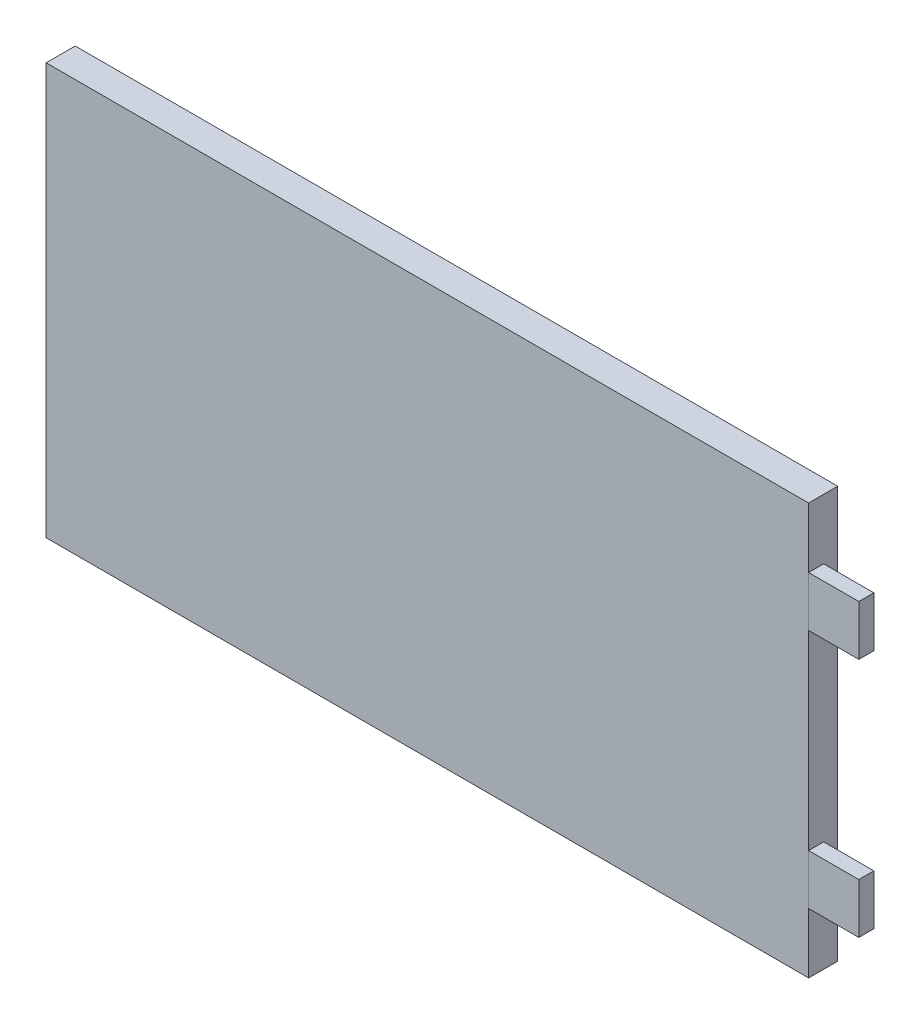
ISO-10303-21;
HEADER;
FILE_DESCRIPTION(('STEP AP214'),'2;1');
FILE_NAME('part.step','',(''),(''),'','','');
FILE_SCHEMA(('AUTOMOTIVE_DESIGN { 1 0 10303 214 1 1 1 1 }'));
ENDSEC;
DATA;
#1=APPLICATION_CONTEXT('core data for automotive mechanical design processes');
#2=APPLICATION_PROTOCOL_DEFINITION('international standard','automotive_design',2000,#1);
#3=PRODUCT_CONTEXT('',#1,'mechanical');
#4=PRODUCT('Part','Part','',(#3));
#5=PRODUCT_RELATED_PRODUCT_CATEGORY('part','',(#4));
#6=PRODUCT_DEFINITION_FORMATION('','',#4);
#7=PRODUCT_DEFINITION_CONTEXT('part definition',#1,'design');
#8=PRODUCT_DEFINITION('design','',#6,#7);
#9=PRODUCT_DEFINITION_SHAPE('','',#8);
#10=(LENGTH_UNIT() NAMED_UNIT(*) SI_UNIT(.MILLI.,.METRE.));
#11=(NAMED_UNIT(*) PLANE_ANGLE_UNIT() SI_UNIT($,.RADIAN.));
#12=(NAMED_UNIT(*) SI_UNIT($,.STERADIAN.) SOLID_ANGLE_UNIT());
#13=UNCERTAINTY_MEASURE_WITH_UNIT(LENGTH_MEASURE(1.E-05),#10,'distance_accuracy_value','');
#14=(GEOMETRIC_REPRESENTATION_CONTEXT(3) GLOBAL_UNCERTAINTY_ASSIGNED_CONTEXT((#13)) GLOBAL_UNIT_ASSIGNED_CONTEXT((#10,
#11,#12)) REPRESENTATION_CONTEXT('',''));
#15=CARTESIAN_POINT('',(0.,0.,0.));
#16=DIRECTION('',(0.,0.,1.));
#17=DIRECTION('',(1.,0.,0.));
#18=AXIS2_PLACEMENT_3D('',#15,#16,#17);
#19=CARTESIAN_POINT('',(38.,-9.5,1.4));
#20=DIRECTION('',(-1.,0.,0.));
#21=DIRECTION('',(0.,0.,1.));
#22=AXIS2_PLACEMENT_3D('',#19,#20,#21);
#23=PLANE('',#22);
#24=DIRECTION('',(0.,-1.,0.));
#25=VECTOR('',#24,1.);
#26=CARTESIAN_POINT('',(38.,-9.5,2.9));
#27=LINE('',#26,#25);
#28=CARTESIAN_POINT('',(38.,-9.5,2.9));
#29=VERTEX_POINT('',#28);
#30=CARTESIAN_POINT('',(38.,-14.5,2.9));
#31=VERTEX_POINT('',#30);
#32=EDGE_CURVE('E109',#29,#31,#27,.T.);
#33=ORIENTED_EDGE('',*,*,#32,.F.);
#34=DIRECTION('',(0.,0.,1.));
#35=VECTOR('',#34,1.);
#36=CARTESIAN_POINT('',(38.,-9.5,1.4));
#37=LINE('',#36,#35);
#38=CARTESIAN_POINT('',(38.,-9.5,1.4));
#39=VERTEX_POINT('',#38);
#40=EDGE_CURVE('E12',#39,#29,#37,.T.);
#41=ORIENTED_EDGE('',*,*,#40,.F.);
#42=DIRECTION('',(0.,-1.,0.));
#43=VECTOR('',#42,1.);
#44=CARTESIAN_POINT('',(38.,-9.5,1.4));
#45=LINE('',#44,#43);
#46=CARTESIAN_POINT('',(38.,-14.5,1.4));
#47=VERTEX_POINT('',#46);
#48=EDGE_CURVE('E103',#39,#47,#45,.T.);
#49=ORIENTED_EDGE('',*,*,#48,.T.);
#50=DIRECTION('',(0.,0.,1.));
#51=VECTOR('',#50,1.);
#52=CARTESIAN_POINT('',(38.,-14.5,1.4));
#53=LINE('',#52,#51);
#54=EDGE_CURVE('E48',#47,#31,#53,.T.);
#55=ORIENTED_EDGE('',*,*,#54,.T.);
#56=EDGE_LOOP('',(#33,#41,#49,#55));
#57=FACE_BOUND('',#56,.T.);
#58=ADVANCED_FACE('F45',(#57),#23,.T.);
#59=CARTESIAN_POINT('',(38.,-9.5,1.4));
#60=DIRECTION('',(0.,1.,0.));
#61=DIRECTION('',(0.,0.,1.));
#62=AXIS2_PLACEMENT_3D('',#59,#60,#61);
#63=PLANE('',#62);
#64=DIRECTION('',(-1.,0.,0.));
#65=VECTOR('',#64,1.);
#66=CARTESIAN_POINT('',(38.,-9.5,2.9));
#67=LINE('',#66,#65);
#68=CARTESIAN_POINT('',(43.,-9.5,2.9));
#69=VERTEX_POINT('',#68);
#70=EDGE_CURVE('E105',#69,#29,#67,.T.);
#71=ORIENTED_EDGE('',*,*,#70,.F.);
#72=DIRECTION('',(0.,0.,1.));
#73=VECTOR('',#72,1.);
#74=CARTESIAN_POINT('',(43.,-9.5,1.4));
#75=LINE('',#74,#73);
#76=CARTESIAN_POINT('',(43.,-9.5,1.4));
#77=VERTEX_POINT('',#76);
#78=EDGE_CURVE('E54',#77,#69,#75,.T.);
#79=ORIENTED_EDGE('',*,*,#78,.F.);
#80=DIRECTION('',(-1.,0.,0.));
#81=VECTOR('',#80,1.);
#82=CARTESIAN_POINT('',(38.,-9.5,1.4));
#83=LINE('',#82,#81);
#84=EDGE_CURVE('E100',#77,#39,#83,.T.);
#85=ORIENTED_EDGE('',*,*,#84,.T.);
#86=ORIENTED_EDGE('',*,*,#40,.T.);
#87=EDGE_LOOP('',(#71,#79,#85,#86));
#88=FACE_BOUND('',#87,.T.);
#89=ADVANCED_FACE('F119',(#88),#63,.T.);
#90=CARTESIAN_POINT('',(43.,-9.5,1.4));
#91=DIRECTION('',(1.,0.,0.));
#92=DIRECTION('',(0.,0.,-1.));
#93=AXIS2_PLACEMENT_3D('',#90,#91,#92);
#94=PLANE('',#93);
#95=DIRECTION('',(0.,1.,0.));
#96=VECTOR('',#95,1.);
#97=CARTESIAN_POINT('',(43.,-9.5,2.9));
#98=LINE('',#97,#96);
#99=CARTESIAN_POINT('',(43.,-14.5,2.9));
#100=VERTEX_POINT('',#99);
#101=EDGE_CURVE('E95',#100,#69,#98,.T.);
#102=ORIENTED_EDGE('',*,*,#101,.F.);
#103=DIRECTION('',(0.,0.,1.));
#104=VECTOR('',#103,1.);
#105=CARTESIAN_POINT('',(43.,-14.5,1.4));
#106=LINE('',#105,#104);
#107=CARTESIAN_POINT('',(43.,-14.5,1.4));
#108=VERTEX_POINT('',#107);
#109=EDGE_CURVE('E90',#108,#100,#106,.T.);
#110=ORIENTED_EDGE('',*,*,#109,.F.);
#111=DIRECTION('',(0.,1.,0.));
#112=VECTOR('',#111,1.);
#113=CARTESIAN_POINT('',(43.,-9.5,1.4));
#114=LINE('',#113,#112);
#115=EDGE_CURVE('E93',#108,#77,#114,.T.);
#116=ORIENTED_EDGE('',*,*,#115,.T.);
#117=ORIENTED_EDGE('',*,*,#78,.T.);
#118=EDGE_LOOP('',(#102,#110,#116,#117));
#119=FACE_BOUND('',#118,.T.);
#120=ADVANCED_FACE('F92',(#119),#94,.T.);
#121=CARTESIAN_POINT('',(38.,-14.5,1.4));
#122=DIRECTION('',(0.,-1.,0.));
#123=DIRECTION('',(1.,0.,0.));
#124=AXIS2_PLACEMENT_3D('',#121,#122,#123);
#125=PLANE('',#124);
#126=DIRECTION('',(1.,0.,0.));
#127=VECTOR('',#126,1.);
#128=CARTESIAN_POINT('',(38.,-14.5,2.9));
#129=LINE('',#128,#127);
#130=EDGE_CURVE('E112',#31,#100,#129,.T.);
#131=ORIENTED_EDGE('',*,*,#130,.F.);
#132=ORIENTED_EDGE('',*,*,#54,.F.);
#133=DIRECTION('',(1.,0.,0.));
#134=VECTOR('',#133,1.);
#135=CARTESIAN_POINT('',(38.,-14.5,1.4));
#136=LINE('',#135,#134);
#137=EDGE_CURVE('E99',#47,#108,#136,.T.);
#138=ORIENTED_EDGE('',*,*,#137,.T.);
#139=ORIENTED_EDGE('',*,*,#109,.T.);
#140=EDGE_LOOP('',(#131,#132,#138,#139));
#141=FACE_BOUND('',#140,.T.);
#142=ADVANCED_FACE('F102',(#141),#125,.T.);
#143=CARTESIAN_POINT('',(0.,0.,1.4));
#144=DIRECTION('',(0.,0.,1.));
#145=DIRECTION('',(1.,0.,0.));
#146=AXIS2_PLACEMENT_3D('',#143,#144,#145);
#147=PLANE('',#146);
#148=ORIENTED_EDGE('',*,*,#48,.F.);
#149=ORIENTED_EDGE('',*,*,#84,.F.);
#150=ORIENTED_EDGE('',*,*,#115,.F.);
#151=ORIENTED_EDGE('',*,*,#137,.F.);
#152=EDGE_LOOP('',(#148,#149,#150,#151));
#153=FACE_BOUND('',#152,.T.);
#154=ADVANCED_FACE('F98',(#153),#147,.F.);
#155=CARTESIAN_POINT('',(0.,0.,2.9));
#156=DIRECTION('',(0.,0.,1.));
#157=DIRECTION('',(1.,0.,0.));
#158=AXIS2_PLACEMENT_3D('',#155,#156,#157);
#159=PLANE('',#158);
#160=ORIENTED_EDGE('',*,*,#32,.T.);
#161=ORIENTED_EDGE('',*,*,#130,.T.);
#162=ORIENTED_EDGE('',*,*,#101,.T.);
#163=ORIENTED_EDGE('',*,*,#70,.T.);
#164=EDGE_LOOP('',(#160,#161,#162,#163));
#165=FACE_BOUND('',#164,.T.);
#166=ADVANCED_FACE('F118',(#165),#159,.T.);
#167=CLOSED_SHELL('',(#58,#89,#120,#142,#154,#166));
#168=MANIFOLD_SOLID_BREP('B2',#167);
#169=CARTESIAN_POINT('',(38.,14.5,1.4));
#170=DIRECTION('',(-1.,0.,0.));
#171=DIRECTION('',(0.,0.,1.));
#172=AXIS2_PLACEMENT_3D('',#169,#170,#171);
#173=PLANE('',#172);
#174=DIRECTION('',(0.,-1.,0.));
#175=VECTOR('',#174,1.);
#176=CARTESIAN_POINT('',(38.,14.5,2.9));
#177=LINE('',#176,#175);
#178=CARTESIAN_POINT('',(38.,14.5,2.9));
#179=VERTEX_POINT('',#178);
#180=CARTESIAN_POINT('',(38.,9.5,2.9));
#181=VERTEX_POINT('',#180);
#182=EDGE_CURVE('E241',#179,#181,#177,.T.);
#183=ORIENTED_EDGE('',*,*,#182,.F.);
#184=DIRECTION('',(0.,0.,1.));
#185=VECTOR('',#184,1.);
#186=CARTESIAN_POINT('',(38.,14.5,1.4));
#187=LINE('',#186,#185);
#188=CARTESIAN_POINT('',(38.,14.5,1.4));
#189=VERTEX_POINT('',#188);
#190=EDGE_CURVE('E43',#189,#179,#187,.T.);
#191=ORIENTED_EDGE('',*,*,#190,.F.);
#192=DIRECTION('',(0.,-1.,0.));
#193=VECTOR('',#192,1.);
#194=CARTESIAN_POINT('',(38.,14.5,1.4));
#195=LINE('',#194,#193);
#196=CARTESIAN_POINT('',(38.,9.5,1.4));
#197=VERTEX_POINT('',#196);
#198=EDGE_CURVE('E235',#189,#197,#195,.T.);
#199=ORIENTED_EDGE('',*,*,#198,.T.);
#200=DIRECTION('',(0.,0.,1.));
#201=VECTOR('',#200,1.);
#202=CARTESIAN_POINT('',(38.,9.5,1.4));
#203=LINE('',#202,#201);
#204=EDGE_CURVE('E180',#197,#181,#203,.T.);
#205=ORIENTED_EDGE('',*,*,#204,.T.);
#206=EDGE_LOOP('',(#183,#191,#199,#205));
#207=FACE_BOUND('',#206,.T.);
#208=ADVANCED_FACE('F177',(#207),#173,.T.);
#209=CARTESIAN_POINT('',(38.,14.5,1.4));
#210=DIRECTION('',(0.,1.,0.));
#211=DIRECTION('',(-1.,0.,0.));
#212=AXIS2_PLACEMENT_3D('',#209,#210,#211);
#213=PLANE('',#212);
#214=DIRECTION('',(-1.,0.,0.));
#215=VECTOR('',#214,1.);
#216=CARTESIAN_POINT('',(38.,14.5,2.9));
#217=LINE('',#216,#215);
#218=CARTESIAN_POINT('',(43.,14.5,2.9));
#219=VERTEX_POINT('',#218);
#220=EDGE_CURVE('E237',#219,#179,#217,.T.);
#221=ORIENTED_EDGE('',*,*,#220,.F.);
#222=DIRECTION('',(0.,0.,1.));
#223=VECTOR('',#222,1.);
#224=CARTESIAN_POINT('',(43.,14.5,1.4));
#225=LINE('',#224,#223);
#226=CARTESIAN_POINT('',(43.,14.5,1.4));
#227=VERTEX_POINT('',#226);
#228=EDGE_CURVE('E186',#227,#219,#225,.T.);
#229=ORIENTED_EDGE('',*,*,#228,.F.);
#230=DIRECTION('',(-1.,0.,0.));
#231=VECTOR('',#230,1.);
#232=CARTESIAN_POINT('',(38.,14.5,1.4));
#233=LINE('',#232,#231);
#234=EDGE_CURVE('E232',#227,#189,#233,.T.);
#235=ORIENTED_EDGE('',*,*,#234,.T.);
#236=ORIENTED_EDGE('',*,*,#190,.T.);
#237=EDGE_LOOP('',(#221,#229,#235,#236));
#238=FACE_BOUND('',#237,.T.);
#239=ADVANCED_FACE('F251',(#238),#213,.T.);
#240=CARTESIAN_POINT('',(43.,14.5,1.4));
#241=DIRECTION('',(1.,0.,0.));
#242=DIRECTION('',(0.,0.,-1.));
#243=AXIS2_PLACEMENT_3D('',#240,#241,#242);
#244=PLANE('',#243);
#245=DIRECTION('',(0.,1.,0.));
#246=VECTOR('',#245,1.);
#247=CARTESIAN_POINT('',(43.,14.5,2.9));
#248=LINE('',#247,#246);
#249=CARTESIAN_POINT('',(43.,9.5,2.9));
#250=VERTEX_POINT('',#249);
#251=EDGE_CURVE('E227',#250,#219,#248,.T.);
#252=ORIENTED_EDGE('',*,*,#251,.F.);
#253=DIRECTION('',(0.,0.,1.));
#254=VECTOR('',#253,1.);
#255=CARTESIAN_POINT('',(43.,9.5,1.4));
#256=LINE('',#255,#254);
#257=CARTESIAN_POINT('',(43.,9.5,1.4));
#258=VERTEX_POINT('',#257);
#259=EDGE_CURVE('E222',#258,#250,#256,.T.);
#260=ORIENTED_EDGE('',*,*,#259,.F.);
#261=DIRECTION('',(0.,1.,0.));
#262=VECTOR('',#261,1.);
#263=CARTESIAN_POINT('',(43.,14.5,1.4));
#264=LINE('',#263,#262);
#265=EDGE_CURVE('E225',#258,#227,#264,.T.);
#266=ORIENTED_EDGE('',*,*,#265,.T.);
#267=ORIENTED_EDGE('',*,*,#228,.T.);
#268=EDGE_LOOP('',(#252,#260,#266,#267));
#269=FACE_BOUND('',#268,.T.);
#270=ADVANCED_FACE('F224',(#269),#244,.T.);
#271=CARTESIAN_POINT('',(38.,9.5,1.4));
#272=DIRECTION('',(0.,-1.,0.));
#273=DIRECTION('',(0.,0.,-1.));
#274=AXIS2_PLACEMENT_3D('',#271,#272,#273);
#275=PLANE('',#274);
#276=DIRECTION('',(1.,0.,0.));
#277=VECTOR('',#276,1.);
#278=CARTESIAN_POINT('',(38.,9.5,2.9));
#279=LINE('',#278,#277);
#280=EDGE_CURVE('E244',#181,#250,#279,.T.);
#281=ORIENTED_EDGE('',*,*,#280,.F.);
#282=ORIENTED_EDGE('',*,*,#204,.F.);
#283=DIRECTION('',(1.,0.,0.));
#284=VECTOR('',#283,1.);
#285=CARTESIAN_POINT('',(38.,9.5,1.4));
#286=LINE('',#285,#284);
#287=EDGE_CURVE('E231',#197,#258,#286,.T.);
#288=ORIENTED_EDGE('',*,*,#287,.T.);
#289=ORIENTED_EDGE('',*,*,#259,.T.);
#290=EDGE_LOOP('',(#281,#282,#288,#289));
#291=FACE_BOUND('',#290,.T.);
#292=ADVANCED_FACE('F234',(#291),#275,.T.);
#293=CARTESIAN_POINT('',(0.,0.,1.4));
#294=DIRECTION('',(0.,0.,1.));
#295=DIRECTION('',(1.,0.,0.));
#296=AXIS2_PLACEMENT_3D('',#293,#294,#295);
#297=PLANE('',#296);
#298=ORIENTED_EDGE('',*,*,#198,.F.);
#299=ORIENTED_EDGE('',*,*,#234,.F.);
#300=ORIENTED_EDGE('',*,*,#265,.F.);
#301=ORIENTED_EDGE('',*,*,#287,.F.);
#302=EDGE_LOOP('',(#298,#299,#300,#301));
#303=FACE_BOUND('',#302,.T.);
#304=ADVANCED_FACE('F230',(#303),#297,.F.);
#305=CARTESIAN_POINT('',(0.,0.,2.9));
#306=DIRECTION('',(0.,0.,1.));
#307=DIRECTION('',(1.,0.,0.));
#308=AXIS2_PLACEMENT_3D('',#305,#306,#307);
#309=PLANE('',#308);
#310=ORIENTED_EDGE('',*,*,#182,.T.);
#311=ORIENTED_EDGE('',*,*,#280,.T.);
#312=ORIENTED_EDGE('',*,*,#251,.T.);
#313=ORIENTED_EDGE('',*,*,#220,.T.);
#314=EDGE_LOOP('',(#310,#311,#312,#313));
#315=FACE_BOUND('',#314,.T.);
#316=ADVANCED_FACE('F250',(#315),#309,.T.);
#317=CLOSED_SHELL('',(#208,#239,#270,#292,#304,#316));
#318=MANIFOLD_SOLID_BREP('B6',#317);
#319=CARTESIAN_POINT('',(38.,20.5,2.9));
#320=DIRECTION('',(-1.,0.,0.));
#321=DIRECTION('',(0.,-1.,0.));
#322=AXIS2_PLACEMENT_3D('',#319,#320,#321);
#323=PLANE('',#322);
#324=DIRECTION('',(0.,1.,0.));
#325=VECTOR('',#324,1.);
#326=CARTESIAN_POINT('',(38.,20.5,0.));
#327=LINE('',#326,#325);
#328=CARTESIAN_POINT('',(38.,-20.5,0.));
#329=VERTEX_POINT('',#328);
#330=CARTESIAN_POINT('',(38.,20.5,0.));
#331=VERTEX_POINT('',#330);
#332=EDGE_CURVE('E369',#329,#331,#327,.T.);
#333=ORIENTED_EDGE('',*,*,#332,.T.);
#334=DIRECTION('',(0.,0.,-1.));
#335=VECTOR('',#334,1.);
#336=CARTESIAN_POINT('',(38.,20.5,2.9));
#337=LINE('',#336,#335);
#338=CARTESIAN_POINT('',(38.,20.5,2.9));
#339=VERTEX_POINT('',#338);
#340=EDGE_CURVE('E175',#339,#331,#337,.T.);
#341=ORIENTED_EDGE('',*,*,#340,.F.);
#342=DIRECTION('',(0.,1.,0.));
#343=VECTOR('',#342,1.);
#344=CARTESIAN_POINT('',(38.,20.5,2.9));
#345=LINE('',#344,#343);
#346=CARTESIAN_POINT('',(38.,-20.5,2.9));
#347=VERTEX_POINT('',#346);
#348=EDGE_CURVE('E357',#347,#339,#345,.T.);
#349=ORIENTED_EDGE('',*,*,#348,.F.);
#350=DIRECTION('',(0.,0.,-1.));
#351=VECTOR('',#350,1.);
#352=CARTESIAN_POINT('',(38.,-20.5,2.9));
#353=LINE('',#352,#351);
#354=EDGE_CURVE('E365',#347,#329,#353,.T.);
#355=ORIENTED_EDGE('',*,*,#354,.T.);
#356=EDGE_LOOP('',(#333,#341,#349,#355));
#357=FACE_BOUND('',#356,.T.);
#358=ADVANCED_FACE('F306',(#357),#323,.F.);
#359=CARTESIAN_POINT('',(-38.,20.5,2.9));
#360=DIRECTION('',(0.,-1.,0.));
#361=DIRECTION('',(0.,0.,-1.));
#362=AXIS2_PLACEMENT_3D('',#359,#360,#361);
#363=PLANE('',#362);
#364=DIRECTION('',(-1.,0.,0.));
#365=VECTOR('',#364,1.);
#366=CARTESIAN_POINT('',(-38.,20.5,0.));
#367=LINE('',#366,#365);
#368=CARTESIAN_POINT('',(-38.,20.5,0.));
#369=VERTEX_POINT('',#368);
#370=EDGE_CURVE('E361',#331,#369,#367,.T.);
#371=ORIENTED_EDGE('',*,*,#370,.T.);
#372=DIRECTION('',(0.,0.,-1.));
#373=VECTOR('',#372,1.);
#374=CARTESIAN_POINT('',(-38.,20.5,2.9));
#375=LINE('',#374,#373);
#376=CARTESIAN_POINT('',(-38.,20.5,2.9));
#377=VERTEX_POINT('',#376);
#378=EDGE_CURVE('E314',#377,#369,#375,.T.);
#379=ORIENTED_EDGE('',*,*,#378,.F.);
#380=DIRECTION('',(-1.,0.,0.));
#381=VECTOR('',#380,1.);
#382=CARTESIAN_POINT('',(-38.,20.5,2.9));
#383=LINE('',#382,#381);
#384=EDGE_CURVE('E352',#339,#377,#383,.T.);
#385=ORIENTED_EDGE('',*,*,#384,.F.);
#386=ORIENTED_EDGE('',*,*,#340,.T.);
#387=EDGE_LOOP('',(#371,#379,#385,#386));
#388=FACE_BOUND('',#387,.T.);
#389=ADVANCED_FACE('F360',(#388),#363,.F.);
#390=CARTESIAN_POINT('',(-38.,20.5,2.9));
#391=DIRECTION('',(1.,0.,0.));
#392=DIRECTION('',(0.,1.,0.));
#393=AXIS2_PLACEMENT_3D('',#390,#391,#392);
#394=PLANE('',#393);
#395=DIRECTION('',(0.,-1.,0.));
#396=VECTOR('',#395,1.);
#397=CARTESIAN_POINT('',(-38.,20.5,0.));
#398=LINE('',#397,#396);
#399=CARTESIAN_POINT('',(-38.,-20.5,0.));
#400=VERTEX_POINT('',#399);
#401=EDGE_CURVE('E339',#369,#400,#398,.T.);
#402=ORIENTED_EDGE('',*,*,#401,.T.);
#403=DIRECTION('',(0.,0.,-1.));
#404=VECTOR('',#403,1.);
#405=CARTESIAN_POINT('',(-38.,-20.5,2.9));
#406=LINE('',#405,#404);
#407=CARTESIAN_POINT('',(-38.,-20.5,2.9));
#408=VERTEX_POINT('',#407);
#409=EDGE_CURVE('E362',#408,#400,#406,.T.);
#410=ORIENTED_EDGE('',*,*,#409,.F.);
#411=DIRECTION('',(0.,-1.,0.));
#412=VECTOR('',#411,1.);
#413=CARTESIAN_POINT('',(-38.,20.5,2.9));
#414=LINE('',#413,#412);
#415=EDGE_CURVE('E355',#377,#408,#414,.T.);
#416=ORIENTED_EDGE('',*,*,#415,.F.);
#417=ORIENTED_EDGE('',*,*,#378,.T.);
#418=EDGE_LOOP('',(#402,#410,#416,#417));
#419=FACE_BOUND('',#418,.T.);
#420=ADVANCED_FACE('F363',(#419),#394,.F.);
#421=CARTESIAN_POINT('',(-38.,-20.5,2.9));
#422=DIRECTION('',(0.,1.,0.));
#423=DIRECTION('',(0.,0.,1.));
#424=AXIS2_PLACEMENT_3D('',#421,#422,#423);
#425=PLANE('',#424);
#426=DIRECTION('',(1.,0.,0.));
#427=VECTOR('',#426,1.);
#428=CARTESIAN_POINT('',(-38.,-20.5,0.));
#429=LINE('',#428,#427);
#430=EDGE_CURVE('E345',#400,#329,#429,.T.);
#431=ORIENTED_EDGE('',*,*,#430,.T.);
#432=ORIENTED_EDGE('',*,*,#354,.F.);
#433=DIRECTION('',(1.,0.,0.));
#434=VECTOR('',#433,1.);
#435=CARTESIAN_POINT('',(-38.,-20.5,2.9));
#436=LINE('',#435,#434);
#437=EDGE_CURVE('E322',#408,#347,#436,.T.);
#438=ORIENTED_EDGE('',*,*,#437,.F.);
#439=ORIENTED_EDGE('',*,*,#409,.T.);
#440=EDGE_LOOP('',(#431,#432,#438,#439));
#441=FACE_BOUND('',#440,.T.);
#442=ADVANCED_FACE('F376',(#441),#425,.F.);
#443=CARTESIAN_POINT('',(0.,0.,2.9));
#444=DIRECTION('',(0.,0.,1.));
#445=DIRECTION('',(1.,0.,0.));
#446=AXIS2_PLACEMENT_3D('',#443,#444,#445);
#447=PLANE('',#446);
#448=ORIENTED_EDGE('',*,*,#348,.T.);
#449=ORIENTED_EDGE('',*,*,#384,.T.);
#450=ORIENTED_EDGE('',*,*,#415,.T.);
#451=ORIENTED_EDGE('',*,*,#437,.T.);
#452=EDGE_LOOP('',(#448,#449,#450,#451));
#453=FACE_BOUND('',#452,.T.);
#454=ADVANCED_FACE('F353',(#453),#447,.T.);
#455=CARTESIAN_POINT('',(0.,0.,0.));
#456=DIRECTION('',(0.,0.,1.));
#457=DIRECTION('',(1.,0.,0.));
#458=AXIS2_PLACEMENT_3D('',#455,#456,#457);
#459=PLANE('',#458);
#460=ORIENTED_EDGE('',*,*,#332,.F.);
#461=ORIENTED_EDGE('',*,*,#430,.F.);
#462=ORIENTED_EDGE('',*,*,#401,.F.);
#463=ORIENTED_EDGE('',*,*,#370,.F.);
#464=EDGE_LOOP('',(#460,#461,#462,#463));
#465=FACE_BOUND('',#464,.T.);
#466=ADVANCED_FACE('F379',(#465),#459,.F.);
#467=CLOSED_SHELL('',(#358,#389,#420,#442,#454,#466));
#468=MANIFOLD_SOLID_BREP('B37',#467);
#469=ADVANCED_BREP_SHAPE_REPRESENTATION('',(#18,#168,#318,#468),#14);
#470=SHAPE_DEFINITION_REPRESENTATION(#9,#469);
ENDSEC;
END-ISO-10303-21;
